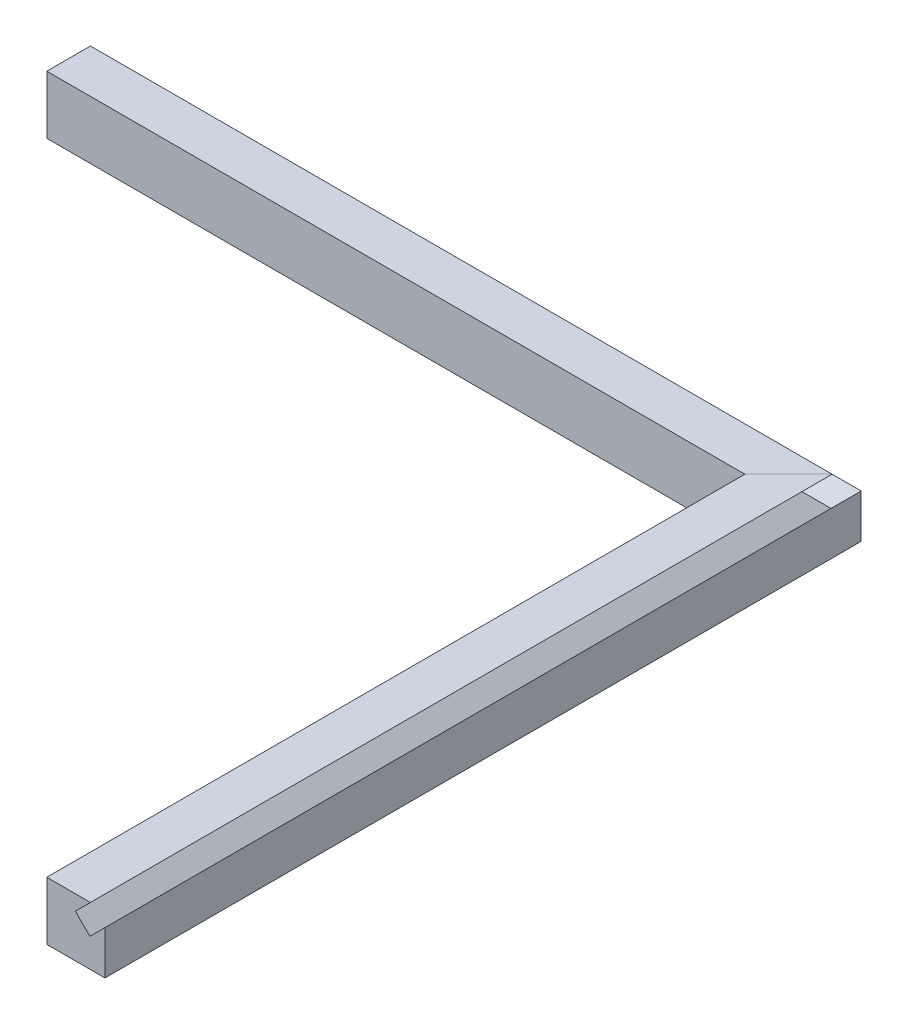
ISO-10303-21;
HEADER;
FILE_DESCRIPTION(('STEP AP214'),'2;1');
FILE_NAME('part.step','',(''),(''),'','','');
FILE_SCHEMA(('AUTOMOTIVE_DESIGN { 1 0 10303 214 1 1 1 1 }'));
ENDSEC;
DATA;
#1=APPLICATION_CONTEXT('core data for automotive mechanical design processes');
#2=APPLICATION_PROTOCOL_DEFINITION('international standard','automotive_design',2000,#1);
#3=PRODUCT_CONTEXT('',#1,'mechanical');
#4=PRODUCT('Part','Part','',(#3));
#5=PRODUCT_RELATED_PRODUCT_CATEGORY('part','',(#4));
#6=PRODUCT_DEFINITION_FORMATION('','',#4);
#7=PRODUCT_DEFINITION_CONTEXT('part definition',#1,'design');
#8=PRODUCT_DEFINITION('design','',#6,#7);
#9=PRODUCT_DEFINITION_SHAPE('','',#8);
#10=(LENGTH_UNIT() NAMED_UNIT(*) SI_UNIT(.MILLI.,.METRE.));
#11=(NAMED_UNIT(*) PLANE_ANGLE_UNIT() SI_UNIT($,.RADIAN.));
#12=(NAMED_UNIT(*) SI_UNIT($,.STERADIAN.) SOLID_ANGLE_UNIT());
#13=UNCERTAINTY_MEASURE_WITH_UNIT(LENGTH_MEASURE(1.E-05),#10,'distance_accuracy_value','');
#14=(GEOMETRIC_REPRESENTATION_CONTEXT(3) GLOBAL_UNCERTAINTY_ASSIGNED_CONTEXT((#13)) GLOBAL_UNIT_ASSIGNED_CONTEXT((#10,
#11,#12)) REPRESENTATION_CONTEXT('',''));
#15=CARTESIAN_POINT('',(0.,0.,0.));
#16=DIRECTION('',(0.,0.,1.));
#17=DIRECTION('',(1.,0.,0.));
#18=AXIS2_PLACEMENT_3D('',#15,#16,#17);
#19=CARTESIAN_POINT('',(-240.,0.,-240.));
#20=DIRECTION('',(1.,0.,0.));
#21=DIRECTION('',(0.,0.,-1.));
#22=AXIS2_PLACEMENT_3D('',#19,#20,#21);
#23=PLANE('',#22);
#24=DIRECTION('',(0.,0.,1.));
#25=VECTOR('',#24,1.);
#26=CARTESIAN_POINT('',(-240.,-4.44280778603902,-240.));
#27=LINE('',#26,#25);
#28=CARTESIAN_POINT('',(-240.,-4.44280778603902,-255.));
#29=VERTEX_POINT('',#28);
#30=CARTESIAN_POINT('',(-240.,-4.44280778603902,-240.));
#31=VERTEX_POINT('',#30);
#32=EDGE_CURVE('E211',#29,#31,#27,.T.);
#33=ORIENTED_EDGE('',*,*,#32,.F.);
#34=DIRECTION('',(0.,0.707106781186552,-0.707106781186543));
#35=VECTOR('',#34,1.);
#36=CARTESIAN_POINT('',(-240.,-9.63113742227387,-249.811670363765));
#37=LINE('',#36,#35);
#38=CARTESIAN_POINT('',(-240.,-9.63113742227387,-249.811670363765));
#39=VERTEX_POINT('',#38);
#40=EDGE_CURVE('E214',#39,#29,#37,.T.);
#41=ORIENTED_EDGE('',*,*,#40,.F.);
#42=DIRECTION('',(0.,0.707106781186543,0.707106781186552));
#43=VECTOR('',#42,1.);
#44=CARTESIAN_POINT('',(-240.,-14.6311374222738,-254.811670363765));
#45=LINE('',#44,#43);
#46=CARTESIAN_POINT('',(-240.,-14.6311374222738,-254.811670363765));
#47=VERTEX_POINT('',#46);
#48=EDGE_CURVE('E158',#47,#39,#45,.T.);
#49=ORIENTED_EDGE('',*,*,#48,.F.);
#50=DIRECTION('',(0.,-0.707106781186537,0.707106781186558));
#51=VECTOR('',#50,1.);
#52=CARTESIAN_POINT('',(-240.,-9.44280778603922,-260.));
#53=LINE('',#52,#51);
#54=CARTESIAN_POINT('',(-240.,-9.44280778603922,-260.));
#55=VERTEX_POINT('',#54);
#56=EDGE_CURVE('E219',#55,#47,#53,.T.);
#57=ORIENTED_EDGE('',*,*,#56,.F.);
#58=DIRECTION('',(0.,1.,0.));
#59=VECTOR('',#58,1.);
#60=CARTESIAN_POINT('',(-240.,-24.442807786039,-260.));
#61=LINE('',#60,#59);
#62=CARTESIAN_POINT('',(-240.,-24.442807786039,-260.));
#63=VERTEX_POINT('',#62);
#64=EDGE_CURVE('E222',#63,#55,#61,.T.);
#65=ORIENTED_EDGE('',*,*,#64,.F.);
#66=DIRECTION('',(0.,0.,-1.));
#67=VECTOR('',#66,1.);
#68=CARTESIAN_POINT('',(-240.,-24.442807786039,-240.));
#69=LINE('',#68,#67);
#70=CARTESIAN_POINT('',(-240.,-24.442807786039,-240.));
#71=VERTEX_POINT('',#70);
#72=EDGE_CURVE('E89',#71,#63,#69,.T.);
#73=ORIENTED_EDGE('',*,*,#72,.F.);
#74=DIRECTION('',(0.,-1.,0.));
#75=VECTOR('',#74,1.);
#76=CARTESIAN_POINT('',(-240.,-4.44280778603902,-240.));
#77=LINE('',#76,#75);
#78=EDGE_CURVE('E97',#31,#71,#77,.T.);
#79=ORIENTED_EDGE('',*,*,#78,.F.);
#80=EDGE_LOOP('',(#33,#41,#49,#57,#65,#73,#79));
#81=FACE_BOUND('',#80,.T.);
#82=ADVANCED_FACE('F45',(#81),#23,.F.);
#83=CARTESIAN_POINT('',(0.,0.,0.));
#84=DIRECTION('',(0.,0.,1.));
#85=DIRECTION('',(1.,0.,0.));
#86=AXIS2_PLACEMENT_3D('',#83,#84,#85);
#87=PLANE('',#86);
#88=DIRECTION('',(-1.,0.,0.));
#89=VECTOR('',#88,1.);
#90=CARTESIAN_POINT('',(0.,-4.44280778603902,0.));
#91=LINE('',#90,#89);
#92=CARTESIAN_POINT('',(15.,-4.44280778603902,0.));
#93=VERTEX_POINT('',#92);
#94=CARTESIAN_POINT('',(0.,-4.44280778603902,0.));
#95=VERTEX_POINT('',#94);
#96=EDGE_CURVE('E192',#93,#95,#91,.T.);
#97=ORIENTED_EDGE('',*,*,#96,.T.);
#98=DIRECTION('',(0.,-1.,0.));
#99=VECTOR('',#98,1.);
#100=CARTESIAN_POINT('',(0.,-4.44280778603902,0.));
#101=LINE('',#100,#99);
#102=CARTESIAN_POINT('',(0.,-24.442807786039,0.));
#103=VERTEX_POINT('',#102);
#104=EDGE_CURVE('E197',#95,#103,#101,.T.);
#105=ORIENTED_EDGE('',*,*,#104,.T.);
#106=DIRECTION('',(1.,0.,0.));
#107=VECTOR('',#106,1.);
#108=CARTESIAN_POINT('',(0.,-24.442807786039,0.));
#109=LINE('',#108,#107);
#110=CARTESIAN_POINT('',(20.,-24.442807786039,0.));
#111=VERTEX_POINT('',#110);
#112=EDGE_CURVE('E105',#103,#111,#109,.T.);
#113=ORIENTED_EDGE('',*,*,#112,.T.);
#114=DIRECTION('',(0.,1.,0.));
#115=VECTOR('',#114,1.);
#116=CARTESIAN_POINT('',(20.,-24.442807786039,0.));
#117=LINE('',#116,#115);
#118=CARTESIAN_POINT('',(20.,-9.44280778603922,0.));
#119=VERTEX_POINT('',#118);
#120=EDGE_CURVE('E243',#111,#119,#117,.T.);
#121=ORIENTED_EDGE('',*,*,#120,.T.);
#122=DIRECTION('',(-0.707106781186558,-0.707106781186537,0.));
#123=VECTOR('',#122,1.);
#124=CARTESIAN_POINT('',(20.,-9.44280778603922,0.));
#125=LINE('',#124,#123);
#126=CARTESIAN_POINT('',(14.8116703637652,-14.6311374222738,0.));
#127=VERTEX_POINT('',#126);
#128=EDGE_CURVE('E248',#119,#127,#125,.T.);
#129=ORIENTED_EDGE('',*,*,#128,.T.);
#130=DIRECTION('',(-0.707106781186552,0.707106781186543,0.));
#131=VECTOR('',#130,1.);
#132=CARTESIAN_POINT('',(14.8116703637652,-14.6311374222738,0.));
#133=LINE('',#132,#131);
#134=CARTESIAN_POINT('',(9.81167036376521,-9.63113742227387,0.));
#135=VERTEX_POINT('',#134);
#136=EDGE_CURVE('E190',#127,#135,#133,.T.);
#137=ORIENTED_EDGE('',*,*,#136,.T.);
#138=DIRECTION('',(0.707106781186543,0.707106781186552,0.));
#139=VECTOR('',#138,1.);
#140=CARTESIAN_POINT('',(9.81167036376521,-9.63113742227387,0.));
#141=LINE('',#140,#139);
#142=EDGE_CURVE('E176',#135,#93,#141,.T.);
#143=ORIENTED_EDGE('',*,*,#142,.T.);
#144=EDGE_LOOP('',(#97,#105,#113,#121,#129,#137,#143));
#145=FACE_BOUND('',#144,.T.);
#146=ADVANCED_FACE('F264',(#145),#87,.T.);
#147=CARTESIAN_POINT('',(22.1,-24.442807786039,-240.));
#148=DIRECTION('',(0.,1.,0.));
#149=DIRECTION('',(0.,0.,1.));
#150=AXIS2_PLACEMENT_3D('',#147,#148,#149);
#151=PLANE('',#150);
#152=DIRECTION('',(-0.707106781186547,0.,0.707106781186548));
#153=VECTOR('',#152,1.);
#154=CARTESIAN_POINT('',(-120.,-24.442807786039,-120.));
#155=LINE('',#154,#153);
#156=CARTESIAN_POINT('',(20.,-24.442807786039,-260.));
#157=VERTEX_POINT('',#156);
#158=CARTESIAN_POINT('',(0.,-24.442807786039,-240.));
#159=VERTEX_POINT('',#158);
#160=EDGE_CURVE('E201',#157,#159,#155,.T.);
#161=ORIENTED_EDGE('',*,*,#160,.T.);
#162=DIRECTION('',(-1.,0.,0.));
#163=VECTOR('',#162,1.);
#164=CARTESIAN_POINT('',(22.1,-24.442807786039,-240.));
#165=LINE('',#164,#163);
#166=EDGE_CURVE('E48',#159,#71,#165,.T.);
#167=ORIENTED_EDGE('',*,*,#166,.T.);
#168=ORIENTED_EDGE('',*,*,#72,.T.);
#169=DIRECTION('',(-1.,0.,0.));
#170=VECTOR('',#169,1.);
#171=CARTESIAN_POINT('',(22.1,-24.442807786039,-260.));
#172=LINE('',#171,#170);
#173=EDGE_CURVE('E237',#157,#63,#172,.T.);
#174=ORIENTED_EDGE('',*,*,#173,.F.);
#175=EDGE_LOOP('',(#161,#167,#168,#174));
#176=FACE_BOUND('',#175,.T.);
#177=ADVANCED_FACE('F274',(#176),#151,.F.);
#178=CARTESIAN_POINT('',(22.1,-24.442807786039,-260.));
#179=DIRECTION('',(0.,0.,1.));
#180=DIRECTION('',(1.,0.,0.));
#181=AXIS2_PLACEMENT_3D('',#178,#179,#180);
#182=PLANE('',#181);
#183=DIRECTION('',(0.,-1.,0.));
#184=VECTOR('',#183,1.);
#185=CARTESIAN_POINT('',(20.,-24.442807786039,-260.));
#186=LINE('',#185,#184);
#187=CARTESIAN_POINT('',(20.,-9.44280778603922,-260.));
#188=VERTEX_POINT('',#187);
#189=EDGE_CURVE('E11',#188,#157,#186,.T.);
#190=ORIENTED_EDGE('',*,*,#189,.T.);
#191=ORIENTED_EDGE('',*,*,#173,.T.);
#192=ORIENTED_EDGE('',*,*,#64,.T.);
#193=DIRECTION('',(-1.,0.,0.));
#194=VECTOR('',#193,1.);
#195=CARTESIAN_POINT('',(22.1,-9.44280778603922,-260.));
#196=LINE('',#195,#194);
#197=EDGE_CURVE('E234',#188,#55,#196,.T.);
#198=ORIENTED_EDGE('',*,*,#197,.F.);
#199=EDGE_LOOP('',(#190,#191,#192,#198));
#200=FACE_BOUND('',#199,.T.);
#201=ADVANCED_FACE('F275',(#200),#182,.F.);
#202=CARTESIAN_POINT('',(22.1,-9.44280778603922,-260.));
#203=DIRECTION('',(0.,-0.707106781186558,-0.707106781186537));
#204=DIRECTION('',(0.,0.707106781186537,-0.707106781186558));
#205=AXIS2_PLACEMENT_3D('',#202,#203,#204);
#206=PLANE('',#205);
#207=DIRECTION('',(0.577350269189631,0.577350269189615,-0.577350269189631));
#208=VECTOR('',#207,1.);
#209=CARTESIAN_POINT('',(-66.6666666666683,-96.1094744527051,-173.333333333332));
#210=LINE('',#209,#208);
#211=CARTESIAN_POINT('',(14.8116703637652,-14.6311374222738,-254.811670363765));
#212=VERTEX_POINT('',#211);
#213=EDGE_CURVE('E55',#212,#188,#210,.T.);
#214=ORIENTED_EDGE('',*,*,#213,.T.);
#215=ORIENTED_EDGE('',*,*,#197,.T.);
#216=ORIENTED_EDGE('',*,*,#56,.T.);
#217=DIRECTION('',(-1.,0.,0.));
#218=VECTOR('',#217,1.);
#219=CARTESIAN_POINT('',(22.1,-14.6311374222738,-254.811670363765));
#220=LINE('',#219,#218);
#221=EDGE_CURVE('E162',#212,#47,#220,.T.);
#222=ORIENTED_EDGE('',*,*,#221,.F.);
#223=EDGE_LOOP('',(#214,#215,#216,#222));
#224=FACE_BOUND('',#223,.T.);
#225=ADVANCED_FACE('F284',(#224),#206,.F.);
#226=CARTESIAN_POINT('',(22.1,-14.6311374222738,-254.811670363765));
#227=DIRECTION('',(0.,-0.707106781186551,0.707106781186543));
#228=DIRECTION('',(0.,-0.707106781186544,-0.707106781186552));
#229=AXIS2_PLACEMENT_3D('',#226,#227,#228);
#230=PLANE('',#229);
#231=DIRECTION('',(0.577350269189628,-0.577350269189621,-0.577350269189628));
#232=VECTOR('',#231,1.);
#233=CARTESIAN_POINT('',(-70.1255530908238,70.3060860323143,-169.874446909176));
#234=LINE('',#233,#232);
#235=CARTESIAN_POINT('',(9.81167036376521,-9.63113742227387,-249.811670363765));
#236=VERTEX_POINT('',#235);
#237=EDGE_CURVE('E141',#236,#212,#234,.T.);
#238=ORIENTED_EDGE('',*,*,#237,.T.);
#239=ORIENTED_EDGE('',*,*,#221,.T.);
#240=ORIENTED_EDGE('',*,*,#48,.T.);
#241=DIRECTION('',(-1.,0.,0.));
#242=VECTOR('',#241,1.);
#243=CARTESIAN_POINT('',(22.1,-9.63113742227387,-249.811670363765));
#244=LINE('',#243,#242);
#245=EDGE_CURVE('E154',#236,#39,#244,.T.);
#246=ORIENTED_EDGE('',*,*,#245,.F.);
#247=EDGE_LOOP('',(#238,#239,#240,#246));
#248=FACE_BOUND('',#247,.T.);
#249=ADVANCED_FACE('F156',(#248),#230,.F.);
#250=CARTESIAN_POINT('',(22.1,-9.63113742227387,-249.811670363765));
#251=DIRECTION('',(0.,0.707106781186543,0.707106781186552));
#252=DIRECTION('',(0.,-0.707106781186552,0.707106781186543));
#253=AXIS2_PLACEMENT_3D('',#250,#251,#252);
#254=PLANE('',#253);
#255=DIRECTION('',(-0.577350269189624,-0.57735026918963,0.577350269189624));
#256=VECTOR('',#255,1.);
#257=CARTESIAN_POINT('',(-73.4588864241559,-92.9016942101959,-166.541113575844));
#258=LINE('',#257,#256);
#259=CARTESIAN_POINT('',(15.,-4.44280778603902,-255.));
#260=VERTEX_POINT('',#259);
#261=EDGE_CURVE('E151',#260,#236,#258,.T.);
#262=ORIENTED_EDGE('',*,*,#261,.T.);
#263=ORIENTED_EDGE('',*,*,#245,.T.);
#264=ORIENTED_EDGE('',*,*,#40,.T.);
#265=DIRECTION('',(-1.,0.,0.));
#266=VECTOR('',#265,1.);
#267=CARTESIAN_POINT('',(22.1,-4.44280778603902,-255.));
#268=LINE('',#267,#266);
#269=EDGE_CURVE('E163',#260,#29,#268,.T.);
#270=ORIENTED_EDGE('',*,*,#269,.F.);
#271=EDGE_LOOP('',(#262,#263,#264,#270));
#272=FACE_BOUND('',#271,.T.);
#273=ADVANCED_FACE('F166',(#272),#254,.F.);
#274=CARTESIAN_POINT('',(22.1,-4.44280778603902,-240.));
#275=DIRECTION('',(0.,-1.,0.));
#276=DIRECTION('',(0.,0.,-1.));
#277=AXIS2_PLACEMENT_3D('',#274,#275,#276);
#278=PLANE('',#277);
#279=DIRECTION('',(0.707106781186547,0.,-0.707106781186548));
#280=VECTOR('',#279,1.);
#281=CARTESIAN_POINT('',(-120.,-4.44280778603902,-120.));
#282=LINE('',#281,#280);
#283=CARTESIAN_POINT('',(0.,-4.44280778603902,-240.));
#284=VERTEX_POINT('',#283);
#285=EDGE_CURVE('E172',#284,#260,#282,.T.);
#286=ORIENTED_EDGE('',*,*,#285,.T.);
#287=ORIENTED_EDGE('',*,*,#269,.T.);
#288=ORIENTED_EDGE('',*,*,#32,.T.);
#289=DIRECTION('',(-1.,0.,0.));
#290=VECTOR('',#289,1.);
#291=CARTESIAN_POINT('',(22.1,-4.44280778603902,-240.));
#292=LINE('',#291,#290);
#293=EDGE_CURVE('E227',#284,#31,#292,.T.);
#294=ORIENTED_EDGE('',*,*,#293,.F.);
#295=EDGE_LOOP('',(#286,#287,#288,#294));
#296=FACE_BOUND('',#295,.T.);
#297=ADVANCED_FACE('F289',(#296),#278,.F.);
#298=CARTESIAN_POINT('',(22.1,-4.44280778603902,-240.));
#299=DIRECTION('',(0.,0.,-1.));
#300=DIRECTION('',(0.,1.,0.));
#301=AXIS2_PLACEMENT_3D('',#298,#299,#300);
#302=PLANE('',#301);
#303=DIRECTION('',(0.,1.,0.));
#304=VECTOR('',#303,1.);
#305=CARTESIAN_POINT('',(0.,-4.44280778603899,-240.));
#306=LINE('',#305,#304);
#307=EDGE_CURVE('E208',#159,#284,#306,.T.);
#308=ORIENTED_EDGE('',*,*,#307,.T.);
#309=ORIENTED_EDGE('',*,*,#293,.T.);
#310=ORIENTED_EDGE('',*,*,#78,.T.);
#311=ORIENTED_EDGE('',*,*,#166,.F.);
#312=EDGE_LOOP('',(#308,#309,#310,#311));
#313=FACE_BOUND('',#312,.T.);
#314=ADVANCED_FACE('F292',(#313),#302,.F.);
#315=CARTESIAN_POINT('',(0.,-4.44280778603902,0.));
#316=DIRECTION('',(1.,0.,0.));
#317=DIRECTION('',(0.,1.,0.));
#318=AXIS2_PLACEMENT_3D('',#315,#316,#317);
#319=PLANE('',#318);
#320=DIRECTION('',(0.,0.,-1.));
#321=VECTOR('',#320,1.);
#322=CARTESIAN_POINT('',(0.,-24.442807786039,0.));
#323=LINE('',#322,#321);
#324=EDGE_CURVE('E204',#103,#159,#323,.T.);
#325=ORIENTED_EDGE('',*,*,#324,.F.);
#326=ORIENTED_EDGE('',*,*,#104,.F.);
#327=DIRECTION('',(0.,0.,-1.));
#328=VECTOR('',#327,1.);
#329=CARTESIAN_POINT('',(0.,-4.44280778603902,0.));
#330=LINE('',#329,#328);
#331=EDGE_CURVE('E184',#95,#284,#330,.T.);
#332=ORIENTED_EDGE('',*,*,#331,.T.);
#333=ORIENTED_EDGE('',*,*,#307,.F.);
#334=EDGE_LOOP('',(#325,#326,#332,#333));
#335=FACE_BOUND('',#334,.T.);
#336=ADVANCED_FACE('F271',(#335),#319,.F.);
#337=CARTESIAN_POINT('',(0.,-4.44280778603902,0.));
#338=DIRECTION('',(0.,-1.,0.));
#339=DIRECTION('',(0.,0.,-1.));
#340=AXIS2_PLACEMENT_3D('',#337,#338,#339);
#341=PLANE('',#340);
#342=ORIENTED_EDGE('',*,*,#331,.F.);
#343=ORIENTED_EDGE('',*,*,#96,.F.);
#344=DIRECTION('',(0.,0.,-1.));
#345=VECTOR('',#344,1.);
#346=CARTESIAN_POINT('',(15.,-4.44280778603902,0.));
#347=LINE('',#346,#345);
#348=EDGE_CURVE('E179',#93,#260,#347,.T.);
#349=ORIENTED_EDGE('',*,*,#348,.T.);
#350=ORIENTED_EDGE('',*,*,#285,.F.);
#351=EDGE_LOOP('',(#342,#343,#349,#350));
#352=FACE_BOUND('',#351,.T.);
#353=ADVANCED_FACE('F267',(#352),#341,.F.);
#354=CARTESIAN_POINT('',(9.81167036376521,-9.63113742227387,0.));
#355=DIRECTION('',(-0.707106781186552,0.707106781186543,0.));
#356=DIRECTION('',(-0.707106781186543,-0.707106781186552,0.));
#357=AXIS2_PLACEMENT_3D('',#354,#355,#356);
#358=PLANE('',#357);
#359=ORIENTED_EDGE('',*,*,#348,.F.);
#360=ORIENTED_EDGE('',*,*,#142,.F.);
#361=DIRECTION('',(0.,0.,-1.));
#362=VECTOR('',#361,1.);
#363=CARTESIAN_POINT('',(9.81167036376521,-9.63113742227387,0.));
#364=LINE('',#363,#362);
#365=EDGE_CURVE('E145',#135,#236,#364,.T.);
#366=ORIENTED_EDGE('',*,*,#365,.T.);
#367=ORIENTED_EDGE('',*,*,#261,.F.);
#368=EDGE_LOOP('',(#359,#360,#366,#367));
#369=FACE_BOUND('',#368,.T.);
#370=ADVANCED_FACE('F174',(#369),#358,.F.);
#371=CARTESIAN_POINT('',(14.8116703637652,-14.6311374222738,0.));
#372=DIRECTION('',(-0.707106781186543,-0.707106781186552,0.));
#373=DIRECTION('',(0.707106781186552,-0.707106781186543,0.));
#374=AXIS2_PLACEMENT_3D('',#371,#372,#373);
#375=PLANE('',#374);
#376=ORIENTED_EDGE('',*,*,#365,.F.);
#377=ORIENTED_EDGE('',*,*,#136,.F.);
#378=DIRECTION('',(0.,0.,-1.));
#379=VECTOR('',#378,1.);
#380=CARTESIAN_POINT('',(14.8116703637652,-14.6311374222738,0.));
#381=LINE('',#380,#379);
#382=EDGE_CURVE('E147',#127,#212,#381,.T.);
#383=ORIENTED_EDGE('',*,*,#382,.T.);
#384=ORIENTED_EDGE('',*,*,#237,.F.);
#385=EDGE_LOOP('',(#376,#377,#383,#384));
#386=FACE_BOUND('',#385,.T.);
#387=ADVANCED_FACE('F143',(#386),#375,.F.);
#388=CARTESIAN_POINT('',(20.,-9.44280778603922,0.));
#389=DIRECTION('',(0.707106781186537,-0.707106781186558,0.));
#390=DIRECTION('',(0.707106781186558,0.707106781186537,0.));
#391=AXIS2_PLACEMENT_3D('',#388,#389,#390);
#392=PLANE('',#391);
#393=ORIENTED_EDGE('',*,*,#382,.F.);
#394=ORIENTED_EDGE('',*,*,#128,.F.);
#395=DIRECTION('',(0.,0.,-1.));
#396=VECTOR('',#395,1.);
#397=CARTESIAN_POINT('',(20.,-9.44280778603922,0.));
#398=LINE('',#397,#396);
#399=EDGE_CURVE('E186',#119,#188,#398,.T.);
#400=ORIENTED_EDGE('',*,*,#399,.T.);
#401=ORIENTED_EDGE('',*,*,#213,.F.);
#402=EDGE_LOOP('',(#393,#394,#400,#401));
#403=FACE_BOUND('',#402,.T.);
#404=ADVANCED_FACE('F279',(#403),#392,.F.);
#405=CARTESIAN_POINT('',(20.,-24.442807786039,0.));
#406=DIRECTION('',(-1.,0.,0.));
#407=DIRECTION('',(0.,0.,1.));
#408=AXIS2_PLACEMENT_3D('',#405,#406,#407);
#409=PLANE('',#408);
#410=ORIENTED_EDGE('',*,*,#399,.F.);
#411=ORIENTED_EDGE('',*,*,#120,.F.);
#412=DIRECTION('',(0.,0.,-1.));
#413=VECTOR('',#412,1.);
#414=CARTESIAN_POINT('',(20.,-24.442807786039,0.));
#415=LINE('',#414,#413);
#416=EDGE_CURVE('E253',#111,#157,#415,.T.);
#417=ORIENTED_EDGE('',*,*,#416,.T.);
#418=ORIENTED_EDGE('',*,*,#189,.F.);
#419=EDGE_LOOP('',(#410,#411,#417,#418));
#420=FACE_BOUND('',#419,.T.);
#421=ADVANCED_FACE('F277',(#420),#409,.F.);
#422=CARTESIAN_POINT('',(0.,-24.442807786039,0.));
#423=DIRECTION('',(0.,1.,0.));
#424=DIRECTION('',(0.,0.,1.));
#425=AXIS2_PLACEMENT_3D('',#422,#423,#424);
#426=PLANE('',#425);
#427=ORIENTED_EDGE('',*,*,#416,.F.);
#428=ORIENTED_EDGE('',*,*,#112,.F.);
#429=ORIENTED_EDGE('',*,*,#324,.T.);
#430=ORIENTED_EDGE('',*,*,#160,.F.);
#431=EDGE_LOOP('',(#427,#428,#429,#430));
#432=FACE_BOUND('',#431,.T.);
#433=ADVANCED_FACE('F273',(#432),#426,.F.);
#434=CLOSED_SHELL('',(#82,#146,#177,#201,#225,#249,#273,#297,#314,#336,#353,#370,#387,#404,#421,#433));
#435=MANIFOLD_SOLID_BREP('B2',#434);
#436=ADVANCED_BREP_SHAPE_REPRESENTATION('',(#18,#435),#14);
#437=SHAPE_DEFINITION_REPRESENTATION(#9,#436);
ENDSEC;
END-ISO-10303-21;
